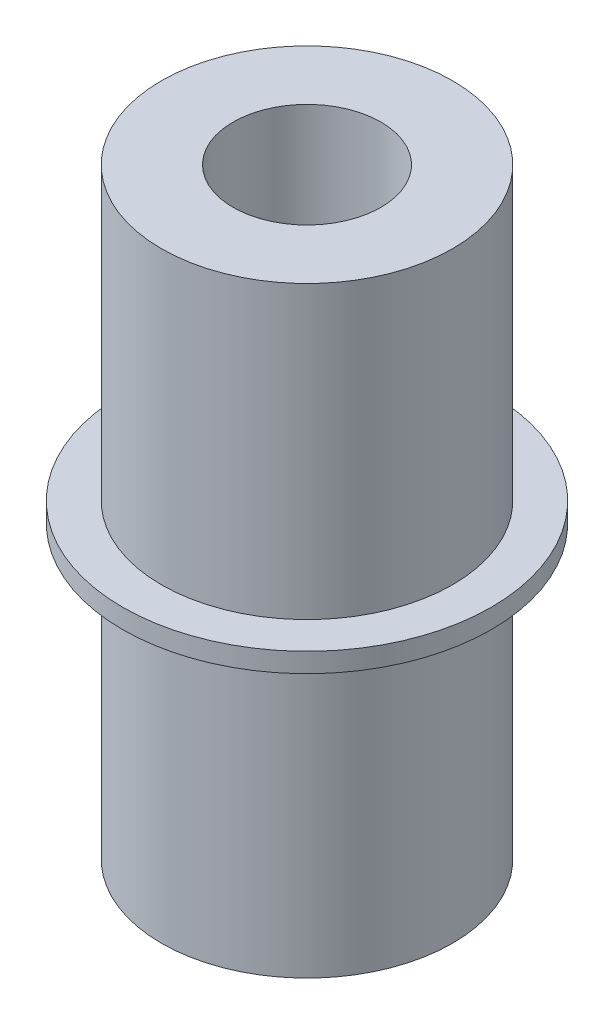
ISO-10303-21;
HEADER;
FILE_DESCRIPTION(('STEP AP214'),'2;1');
FILE_NAME('part.step','',(''),(''),'','','');
FILE_SCHEMA(('AUTOMOTIVE_DESIGN { 1 0 10303 214 1 1 1 1 }'));
ENDSEC;
DATA;
#1=APPLICATION_CONTEXT('core data for automotive mechanical design processes');
#2=APPLICATION_PROTOCOL_DEFINITION('international standard','automotive_design',2000,#1);
#3=PRODUCT_CONTEXT('',#1,'mechanical');
#4=PRODUCT('Part','Part','',(#3));
#5=PRODUCT_RELATED_PRODUCT_CATEGORY('part','',(#4));
#6=PRODUCT_DEFINITION_FORMATION('','',#4);
#7=PRODUCT_DEFINITION_CONTEXT('part definition',#1,'design');
#8=PRODUCT_DEFINITION('design','',#6,#7);
#9=PRODUCT_DEFINITION_SHAPE('','',#8);
#10=(LENGTH_UNIT() NAMED_UNIT(*) SI_UNIT(.MILLI.,.METRE.));
#11=(NAMED_UNIT(*) PLANE_ANGLE_UNIT() SI_UNIT($,.RADIAN.));
#12=(NAMED_UNIT(*) SI_UNIT($,.STERADIAN.) SOLID_ANGLE_UNIT());
#13=UNCERTAINTY_MEASURE_WITH_UNIT(LENGTH_MEASURE(1.E-05),#10,'distance_accuracy_value','');
#14=(GEOMETRIC_REPRESENTATION_CONTEXT(3) GLOBAL_UNCERTAINTY_ASSIGNED_CONTEXT((#13)) GLOBAL_UNIT_ASSIGNED_CONTEXT((#10,
#11,#12)) REPRESENTATION_CONTEXT('',''));
#15=CARTESIAN_POINT('',(0.,0.,0.));
#16=DIRECTION('',(0.,0.,1.));
#17=DIRECTION('',(1.,0.,0.));
#18=AXIS2_PLACEMENT_3D('',#15,#16,#17);
#19=CARTESIAN_POINT('',(-7.5,-15.5,0.));
#20=DIRECTION('',(0.,1.,0.));
#21=DIRECTION('',(0.,0.,1.));
#22=AXIS2_PLACEMENT_3D('',#19,#20,#21);
#23=PLANE('',#22);
#24=CARTESIAN_POINT('',(0.,-15.5,0.));
#25=DIRECTION('',(0.,-1.,0.));
#26=DIRECTION('',(0.,0.,-1.));
#27=AXIS2_PLACEMENT_3D('',#24,#25,#26);
#28=CIRCLE('',#27,3.81);
#29=CARTESIAN_POINT('',(0.,-15.5,-3.81));
#30=VERTEX_POINT('',#29);
#31=EDGE_CURVE('E10',#30,#30,#28,.T.);
#32=ORIENTED_EDGE('',*,*,#31,.F.);
#33=EDGE_LOOP('',(#32));
#34=FACE_BOUND('',#33,.T.);
#35=CARTESIAN_POINT('',(0.,-15.5,0.));
#36=DIRECTION('',(0.,-1.,0.));
#37=DIRECTION('',(0.,0.,-1.));
#38=AXIS2_PLACEMENT_3D('',#35,#36,#37);
#39=CIRCLE('',#38,7.5);
#40=CARTESIAN_POINT('',(0.,-15.5,-7.5));
#41=VERTEX_POINT('',#40);
#42=EDGE_CURVE('E74',#41,#41,#39,.T.);
#43=ORIENTED_EDGE('',*,*,#42,.T.);
#44=EDGE_LOOP('',(#43));
#45=FACE_BOUND('',#44,.T.);
#46=ADVANCED_FACE('F39',(#34,#45),#23,.F.);
#47=CARTESIAN_POINT('',(0.,0.,0.));
#48=DIRECTION('',(0.,-1.,0.));
#49=DIRECTION('',(0.,0.,-1.));
#50=AXIS2_PLACEMENT_3D('',#47,#48,#49);
#51=CYLINDRICAL_SURFACE('',#50,3.81);
#52=CARTESIAN_POINT('',(0.,15.5,0.));
#53=DIRECTION('',(0.,-1.,0.));
#54=DIRECTION('',(0.,0.,-1.));
#55=AXIS2_PLACEMENT_3D('',#52,#53,#54);
#56=CIRCLE('',#55,3.81);
#57=CARTESIAN_POINT('',(0.,15.5,-3.81));
#58=VERTEX_POINT('',#57);
#59=EDGE_CURVE('E46',#58,#58,#56,.T.);
#60=ORIENTED_EDGE('',*,*,#59,.F.);
#61=EDGE_LOOP('',(#60));
#62=FACE_BOUND('',#61,.T.);
#63=ORIENTED_EDGE('',*,*,#31,.T.);
#64=EDGE_LOOP('',(#63));
#65=FACE_BOUND('',#64,.T.);
#66=ADVANCED_FACE('F112',(#62,#65),#51,.F.);
#67=CARTESIAN_POINT('',(-3.81,15.5,0.));
#68=DIRECTION('',(0.,-1.,0.));
#69=DIRECTION('',(0.,0.,-1.));
#70=AXIS2_PLACEMENT_3D('',#67,#68,#69);
#71=PLANE('',#70);
#72=CARTESIAN_POINT('',(0.,15.5,0.));
#73=DIRECTION('',(0.,-1.,0.));
#74=DIRECTION('',(0.,0.,-1.));
#75=AXIS2_PLACEMENT_3D('',#72,#73,#74);
#76=CIRCLE('',#75,7.5);
#77=CARTESIAN_POINT('',(0.,15.5,-7.5));
#78=VERTEX_POINT('',#77);
#79=EDGE_CURVE('E51',#78,#78,#76,.T.);
#80=ORIENTED_EDGE('',*,*,#79,.F.);
#81=EDGE_LOOP('',(#80));
#82=FACE_BOUND('',#81,.T.);
#83=ORIENTED_EDGE('',*,*,#59,.T.);
#84=EDGE_LOOP('',(#83));
#85=FACE_BOUND('',#84,.T.);
#86=ADVANCED_FACE('F107',(#82,#85),#71,.F.);
#87=CARTESIAN_POINT('',(0.,0.,0.));
#88=DIRECTION('',(0.,-1.,0.));
#89=DIRECTION('',(0.,0.,-1.));
#90=AXIS2_PLACEMENT_3D('',#87,#88,#89);
#91=CYLINDRICAL_SURFACE('',#90,7.5);
#92=CARTESIAN_POINT('',(0.,0.5,0.));
#93=DIRECTION('',(0.,-1.,0.));
#94=DIRECTION('',(0.,0.,-1.));
#95=AXIS2_PLACEMENT_3D('',#92,#93,#94);
#96=CIRCLE('',#95,7.5);
#97=CARTESIAN_POINT('',(0.,0.5,-7.5));
#98=VERTEX_POINT('',#97);
#99=EDGE_CURVE('E56',#98,#98,#96,.T.);
#100=ORIENTED_EDGE('',*,*,#99,.F.);
#101=EDGE_LOOP('',(#100));
#102=FACE_BOUND('',#101,.T.);
#103=ORIENTED_EDGE('',*,*,#79,.T.);
#104=EDGE_LOOP('',(#103));
#105=FACE_BOUND('',#104,.T.);
#106=ADVANCED_FACE('F101',(#102,#105),#91,.T.);
#107=CARTESIAN_POINT('',(-7.5,0.500000000000001,0.));
#108=DIRECTION('',(0.,-1.,0.));
#109=DIRECTION('',(0.,0.,-1.));
#110=AXIS2_PLACEMENT_3D('',#107,#108,#109);
#111=PLANE('',#110);
#112=CARTESIAN_POINT('',(0.,0.500000000000001,0.));
#113=DIRECTION('',(0.,-1.,0.));
#114=DIRECTION('',(0.,0.,-1.));
#115=AXIS2_PLACEMENT_3D('',#112,#113,#114);
#116=CIRCLE('',#115,9.5);
#117=CARTESIAN_POINT('',(0.,0.500000000000001,-9.5));
#118=VERTEX_POINT('',#117);
#119=EDGE_CURVE('E62',#118,#118,#116,.T.);
#120=ORIENTED_EDGE('',*,*,#119,.F.);
#121=EDGE_LOOP('',(#120));
#122=FACE_BOUND('',#121,.T.);
#123=ORIENTED_EDGE('',*,*,#99,.T.);
#124=EDGE_LOOP('',(#123));
#125=FACE_BOUND('',#124,.T.);
#126=ADVANCED_FACE('F95',(#122,#125),#111,.F.);
#127=CARTESIAN_POINT('',(0.,0.,0.));
#128=DIRECTION('',(0.,-1.,0.));
#129=DIRECTION('',(0.,0.,-1.));
#130=AXIS2_PLACEMENT_3D('',#127,#128,#129);
#131=CYLINDRICAL_SURFACE('',#130,9.5);
#132=CARTESIAN_POINT('',(0.,-0.499999999999999,0.));
#133=DIRECTION('',(0.,-1.,0.));
#134=DIRECTION('',(0.,0.,-1.));
#135=AXIS2_PLACEMENT_3D('',#132,#133,#134);
#136=CIRCLE('',#135,9.5);
#137=CARTESIAN_POINT('',(0.,-0.499999999999999,-9.5));
#138=VERTEX_POINT('',#137);
#139=EDGE_CURVE('E66',#138,#138,#136,.T.);
#140=ORIENTED_EDGE('',*,*,#139,.F.);
#141=EDGE_LOOP('',(#140));
#142=FACE_BOUND('',#141,.T.);
#143=ORIENTED_EDGE('',*,*,#119,.T.);
#144=EDGE_LOOP('',(#143));
#145=FACE_BOUND('',#144,.T.);
#146=ADVANCED_FACE('F89',(#142,#145),#131,.T.);
#147=CARTESIAN_POINT('',(-9.5,-0.499999999999999,0.));
#148=DIRECTION('',(0.,1.,0.));
#149=DIRECTION('',(0.,0.,1.));
#150=AXIS2_PLACEMENT_3D('',#147,#148,#149);
#151=PLANE('',#150);
#152=CARTESIAN_POINT('',(0.,-0.5,0.));
#153=DIRECTION('',(0.,-1.,0.));
#154=DIRECTION('',(0.,0.,-1.));
#155=AXIS2_PLACEMENT_3D('',#152,#153,#154);
#156=CIRCLE('',#155,7.5);
#157=CARTESIAN_POINT('',(0.,-0.5,-7.5));
#158=VERTEX_POINT('',#157);
#159=EDGE_CURVE('E70',#158,#158,#156,.T.);
#160=ORIENTED_EDGE('',*,*,#159,.F.);
#161=EDGE_LOOP('',(#160));
#162=FACE_BOUND('',#161,.T.);
#163=ORIENTED_EDGE('',*,*,#139,.T.);
#164=EDGE_LOOP('',(#163));
#165=FACE_BOUND('',#164,.T.);
#166=ADVANCED_FACE('F83',(#162,#165),#151,.F.);
#167=CARTESIAN_POINT('',(0.,0.,0.));
#168=DIRECTION('',(0.,-1.,0.));
#169=DIRECTION('',(0.,0.,-1.));
#170=AXIS2_PLACEMENT_3D('',#167,#168,#169);
#171=CYLINDRICAL_SURFACE('',#170,7.5);
#172=ORIENTED_EDGE('',*,*,#42,.F.);
#173=EDGE_LOOP('',(#172));
#174=FACE_BOUND('',#173,.T.);
#175=ORIENTED_EDGE('',*,*,#159,.T.);
#176=EDGE_LOOP('',(#175));
#177=FACE_BOUND('',#176,.T.);
#178=ADVANCED_FACE('F80',(#174,#177),#171,.T.);
#179=CLOSED_SHELL('',(#46,#66,#86,#106,#126,#146,#166,#178));
#180=MANIFOLD_SOLID_BREP('B2',#179);
#181=ADVANCED_BREP_SHAPE_REPRESENTATION('',(#18,#180),#14);
#182=SHAPE_DEFINITION_REPRESENTATION(#9,#181);
ENDSEC;
END-ISO-10303-21;
